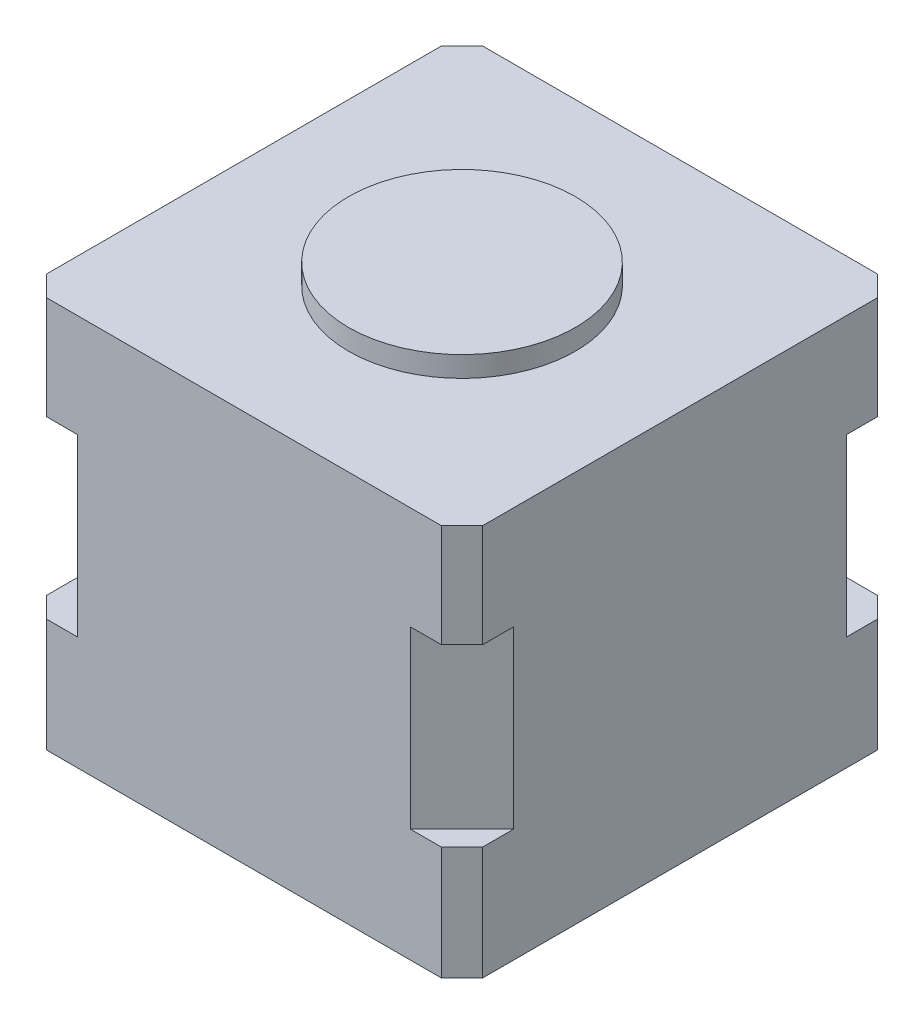
ISO-10303-21;
HEADER;
FILE_DESCRIPTION(('STEP AP214'),'2;1');
FILE_NAME('part.step','',(''),(''),'','','');
FILE_SCHEMA(('AUTOMOTIVE_DESIGN { 1 0 10303 214 1 1 1 1 }'));
ENDSEC;
DATA;
#1=APPLICATION_CONTEXT('core data for automotive mechanical design processes');
#2=APPLICATION_PROTOCOL_DEFINITION('international standard','automotive_design',2000,#1);
#3=PRODUCT_CONTEXT('',#1,'mechanical');
#4=PRODUCT('Part','Part','',(#3));
#5=PRODUCT_RELATED_PRODUCT_CATEGORY('part','',(#4));
#6=PRODUCT_DEFINITION_FORMATION('','',#4);
#7=PRODUCT_DEFINITION_CONTEXT('part definition',#1,'design');
#8=PRODUCT_DEFINITION('design','',#6,#7);
#9=PRODUCT_DEFINITION_SHAPE('','',#8);
#10=(LENGTH_UNIT() NAMED_UNIT(*) SI_UNIT(.MILLI.,.METRE.));
#11=(NAMED_UNIT(*) PLANE_ANGLE_UNIT() SI_UNIT($,.RADIAN.));
#12=(NAMED_UNIT(*) SI_UNIT($,.STERADIAN.) SOLID_ANGLE_UNIT());
#13=UNCERTAINTY_MEASURE_WITH_UNIT(LENGTH_MEASURE(1.E-05),#10,'distance_accuracy_value','');
#14=(GEOMETRIC_REPRESENTATION_CONTEXT(3) GLOBAL_UNCERTAINTY_ASSIGNED_CONTEXT((#13)) GLOBAL_UNIT_ASSIGNED_CONTEXT((#10,
#11,#12)) REPRESENTATION_CONTEXT('',''));
#15=CARTESIAN_POINT('',(0.,0.,0.));
#16=DIRECTION('',(0.,0.,1.));
#17=DIRECTION('',(1.,0.,0.));
#18=AXIS2_PLACEMENT_3D('',#15,#16,#17);
#19=CARTESIAN_POINT('',(0.,11.,0.));
#20=DIRECTION('',(0.,-1.,0.));
#21=DIRECTION('',(0.,0.,-1.));
#22=AXIS2_PLACEMENT_3D('',#19,#20,#21);
#23=PLANE('',#22);
#24=DIRECTION('',(0.707106781186548,0.,0.707106781186548));
#25=VECTOR('',#24,1.);
#26=CARTESIAN_POINT('',(-21.15,11.,16.15));
#27=LINE('',#26,#25);
#28=CARTESIAN_POINT('',(-21.15,11.,16.15));
#29=VERTEX_POINT('',#28);
#30=CARTESIAN_POINT('',(-16.15,11.,21.15));
#31=VERTEX_POINT('',#30);
#32=EDGE_CURVE('E66',#29,#31,#27,.T.);
#33=ORIENTED_EDGE('',*,*,#32,.F.);
#34=DIRECTION('',(0.,0.,1.));
#35=VECTOR('',#34,1.);
#36=CARTESIAN_POINT('',(-21.15,11.,-19.15));
#37=LINE('',#36,#35);
#38=CARTESIAN_POINT('',(-21.15,11.,19.15));
#39=VERTEX_POINT('',#38);
#40=EDGE_CURVE('E330',#29,#39,#37,.T.);
#41=ORIENTED_EDGE('',*,*,#40,.T.);
#42=DIRECTION('',(0.707106781186546,0.,0.707106781186549));
#43=VECTOR('',#42,1.);
#44=CARTESIAN_POINT('',(-21.15,11.,19.15));
#45=LINE('',#44,#43);
#46=CARTESIAN_POINT('',(-19.15,11.,21.15));
#47=VERTEX_POINT('',#46);
#48=EDGE_CURVE('E333',#39,#47,#45,.T.);
#49=ORIENTED_EDGE('',*,*,#48,.T.);
#50=DIRECTION('',(1.,0.,0.));
#51=VECTOR('',#50,1.);
#52=CARTESIAN_POINT('',(-19.15,11.,21.15));
#53=LINE('',#52,#51);
#54=EDGE_CURVE('E309',#47,#31,#53,.T.);
#55=ORIENTED_EDGE('',*,*,#54,.T.);
#56=EDGE_LOOP('',(#33,#41,#49,#55));
#57=FACE_BOUND('',#56,.T.);
#58=ADVANCED_FACE('F49',(#57),#23,.F.);
#59=DIRECTION('',(-0.707106781186548,0.,0.707106781186548));
#60=VECTOR('',#59,1.);
#61=CARTESIAN_POINT('',(-21.15,11.,-16.15));
#62=LINE('',#61,#60);
#63=CARTESIAN_POINT('',(-16.15,11.,-21.15));
#64=VERTEX_POINT('',#63);
#65=CARTESIAN_POINT('',(-21.15,11.,-16.15));
#66=VERTEX_POINT('',#65);
#67=EDGE_CURVE('E272',#64,#66,#62,.T.);
#68=ORIENTED_EDGE('',*,*,#67,.F.);
#69=DIRECTION('',(-1.,0.,0.));
#70=VECTOR('',#69,1.);
#71=CARTESIAN_POINT('',(-19.15,11.,-21.15));
#72=LINE('',#71,#70);
#73=CARTESIAN_POINT('',(-19.15,11.,-21.15));
#74=VERTEX_POINT('',#73);
#75=EDGE_CURVE('E323',#64,#74,#72,.T.);
#76=ORIENTED_EDGE('',*,*,#75,.T.);
#77=DIRECTION('',(-0.707106781186549,0.,0.707106781186546));
#78=VECTOR('',#77,1.);
#79=CARTESIAN_POINT('',(-21.15,11.,-19.15));
#80=LINE('',#79,#78);
#81=CARTESIAN_POINT('',(-21.15,11.,-19.15));
#82=VERTEX_POINT('',#81);
#83=EDGE_CURVE('E327',#74,#82,#80,.T.);
#84=ORIENTED_EDGE('',*,*,#83,.T.);
#85=EDGE_CURVE('E74',#82,#66,#37,.T.);
#86=ORIENTED_EDGE('',*,*,#85,.T.);
#87=EDGE_LOOP('',(#68,#76,#84,#86));
#88=FACE_BOUND('',#87,.T.);
#89=ADVANCED_FACE('F554',(#88),#23,.F.);
#90=DIRECTION('',(-0.707106781186547,0.,-0.707106781186548));
#91=VECTOR('',#90,1.);
#92=CARTESIAN_POINT('',(16.15,11.,-21.15));
#93=LINE('',#92,#91);
#94=CARTESIAN_POINT('',(21.15,11.,-16.15));
#95=VERTEX_POINT('',#94);
#96=CARTESIAN_POINT('',(16.15,11.,-21.15));
#97=VERTEX_POINT('',#96);
#98=EDGE_CURVE('E246',#95,#97,#93,.T.);
#99=ORIENTED_EDGE('',*,*,#98,.F.);
#100=DIRECTION('',(0.,0.,-1.));
#101=VECTOR('',#100,1.);
#102=CARTESIAN_POINT('',(21.15,11.,-19.15));
#103=LINE('',#102,#101);
#104=CARTESIAN_POINT('',(21.15,11.,-19.15));
#105=VERTEX_POINT('',#104);
#106=EDGE_CURVE('E316',#95,#105,#103,.T.);
#107=ORIENTED_EDGE('',*,*,#106,.T.);
#108=DIRECTION('',(-0.707106781186549,0.,-0.707106781186546));
#109=VECTOR('',#108,1.);
#110=CARTESIAN_POINT('',(19.15,11.,-21.15));
#111=LINE('',#110,#109);
#112=CARTESIAN_POINT('',(19.15,11.,-21.15));
#113=VERTEX_POINT('',#112);
#114=EDGE_CURVE('E320',#105,#113,#111,.T.);
#115=ORIENTED_EDGE('',*,*,#114,.T.);
#116=EDGE_CURVE('E324',#113,#97,#72,.T.);
#117=ORIENTED_EDGE('',*,*,#116,.T.);
#118=EDGE_LOOP('',(#99,#107,#115,#117));
#119=FACE_BOUND('',#118,.T.);
#120=ADVANCED_FACE('F414',(#119),#23,.F.);
#121=DIRECTION('',(0.707106781186548,0.,-0.707106781186548));
#122=VECTOR('',#121,1.);
#123=CARTESIAN_POINT('',(16.15,11.,21.15));
#124=LINE('',#123,#122);
#125=CARTESIAN_POINT('',(16.15,11.,21.15));
#126=VERTEX_POINT('',#125);
#127=CARTESIAN_POINT('',(21.15,11.,16.15));
#128=VERTEX_POINT('',#127);
#129=EDGE_CURVE('E241',#126,#128,#124,.T.);
#130=ORIENTED_EDGE('',*,*,#129,.F.);
#131=CARTESIAN_POINT('',(19.15,11.,21.15));
#132=VERTEX_POINT('',#131);
#133=EDGE_CURVE('E313',#126,#132,#53,.T.);
#134=ORIENTED_EDGE('',*,*,#133,.T.);
#135=DIRECTION('',(0.707106781186549,0.,-0.707106781186546));
#136=VECTOR('',#135,1.);
#137=CARTESIAN_POINT('',(19.15,11.,21.15));
#138=LINE('',#137,#136);
#139=CARTESIAN_POINT('',(21.15,11.,19.15));
#140=VERTEX_POINT('',#139);
#141=EDGE_CURVE('E312',#132,#140,#138,.T.);
#142=ORIENTED_EDGE('',*,*,#141,.T.);
#143=EDGE_CURVE('E317',#140,#128,#103,.T.);
#144=ORIENTED_EDGE('',*,*,#143,.T.);
#145=EDGE_LOOP('',(#130,#134,#142,#144));
#146=FACE_BOUND('',#145,.T.);
#147=ADVANCED_FACE('F418',(#146),#23,.F.);
#148=CARTESIAN_POINT('',(-19.15,11.,21.15));
#149=DIRECTION('',(0.,0.,-1.));
#150=DIRECTION('',(-1.,0.,0.));
#151=AXIS2_PLACEMENT_3D('',#148,#149,#150);
#152=PLANE('',#151);
#153=DIRECTION('',(1.,0.,0.));
#154=VECTOR('',#153,1.);
#155=CARTESIAN_POINT('',(-19.15,0.,21.15));
#156=LINE('',#155,#154);
#157=CARTESIAN_POINT('',(-19.15,0.,21.15));
#158=VERTEX_POINT('',#157);
#159=CARTESIAN_POINT('',(19.15,0.,21.15));
#160=VERTEX_POINT('',#159);
#161=EDGE_CURVE('E308',#158,#160,#156,.T.);
#162=ORIENTED_EDGE('',*,*,#161,.T.);
#163=DIRECTION('',(0.,-1.,0.));
#164=VECTOR('',#163,1.);
#165=CARTESIAN_POINT('',(19.15,11.,21.15));
#166=LINE('',#165,#164);
#167=EDGE_CURVE('E53',#132,#160,#166,.T.);
#168=ORIENTED_EDGE('',*,*,#167,.F.);
#169=ORIENTED_EDGE('',*,*,#133,.F.);
#170=DIRECTION('',(0.,-1.,0.));
#171=VECTOR('',#170,1.);
#172=CARTESIAN_POINT('',(16.15,28.,21.15));
#173=LINE('',#172,#171);
#174=CARTESIAN_POINT('',(16.15,28.,21.15));
#175=VERTEX_POINT('',#174);
#176=EDGE_CURVE('E304',#175,#126,#173,.T.);
#177=ORIENTED_EDGE('',*,*,#176,.F.);
#178=DIRECTION('',(1.,0.,0.));
#179=VECTOR('',#178,1.);
#180=CARTESIAN_POINT('',(-19.15,28.,21.15));
#181=LINE('',#180,#179);
#182=CARTESIAN_POINT('',(19.15,28.,21.15));
#183=VERTEX_POINT('',#182);
#184=EDGE_CURVE('E238',#175,#183,#181,.T.);
#185=ORIENTED_EDGE('',*,*,#184,.T.);
#186=DIRECTION('',(0.,-1.,0.));
#187=VECTOR('',#186,1.);
#188=CARTESIAN_POINT('',(19.15,38.,21.15));
#189=LINE('',#188,#187);
#190=CARTESIAN_POINT('',(19.15,38.,21.15));
#191=VERTEX_POINT('',#190);
#192=EDGE_CURVE('E216',#191,#183,#189,.T.);
#193=ORIENTED_EDGE('',*,*,#192,.F.);
#194=DIRECTION('',(1.,0.,0.));
#195=VECTOR('',#194,1.);
#196=CARTESIAN_POINT('',(-19.15,38.,21.15));
#197=LINE('',#196,#195);
#198=CARTESIAN_POINT('',(-19.15,38.,21.15));
#199=VERTEX_POINT('',#198);
#200=EDGE_CURVE('E223',#199,#191,#197,.T.);
#201=ORIENTED_EDGE('',*,*,#200,.F.);
#202=DIRECTION('',(0.,-1.,0.));
#203=VECTOR('',#202,1.);
#204=CARTESIAN_POINT('',(-19.15,38.,21.15));
#205=LINE('',#204,#203);
#206=CARTESIAN_POINT('',(-19.15,28.,21.15));
#207=VERTEX_POINT('',#206);
#208=EDGE_CURVE('E452',#199,#207,#205,.T.);
#209=ORIENTED_EDGE('',*,*,#208,.T.);
#210=CARTESIAN_POINT('',(-16.15,28.,21.15));
#211=VERTEX_POINT('',#210);
#212=EDGE_CURVE('E503',#207,#211,#181,.T.);
#213=ORIENTED_EDGE('',*,*,#212,.T.);
#214=DIRECTION('',(0.,-1.,0.));
#215=VECTOR('',#214,1.);
#216=CARTESIAN_POINT('',(-16.15,28.,21.15));
#217=LINE('',#216,#215);
#218=EDGE_CURVE('E267',#211,#31,#217,.T.);
#219=ORIENTED_EDGE('',*,*,#218,.T.);
#220=ORIENTED_EDGE('',*,*,#54,.F.);
#221=DIRECTION('',(0.,-1.,0.));
#222=VECTOR('',#221,1.);
#223=CARTESIAN_POINT('',(-19.15,11.,21.15));
#224=LINE('',#223,#222);
#225=EDGE_CURVE('E336',#47,#158,#224,.T.);
#226=ORIENTED_EDGE('',*,*,#225,.T.);
#227=EDGE_LOOP('',(#162,#168,#169,#177,#185,#193,#201,#209,#213,#219,#220,#226));
#228=FACE_BOUND('',#227,.T.);
#229=ADVANCED_FACE('F51',(#228),#152,.F.);
#230=CARTESIAN_POINT('',(19.15,11.,21.15));
#231=DIRECTION('',(-0.707106781186546,0.,-0.707106781186549));
#232=DIRECTION('',(-0.707106781186549,0.,0.707106781186546));
#233=AXIS2_PLACEMENT_3D('',#230,#231,#232);
#234=PLANE('',#233);
#235=DIRECTION('',(0.707106781186549,0.,-0.707106781186546));
#236=VECTOR('',#235,1.);
#237=CARTESIAN_POINT('',(19.15,0.,21.15));
#238=LINE('',#237,#236);
#239=CARTESIAN_POINT('',(21.15,0.,19.15));
#240=VERTEX_POINT('',#239);
#241=EDGE_CURVE('E339',#160,#240,#238,.T.);
#242=ORIENTED_EDGE('',*,*,#241,.T.);
#243=DIRECTION('',(0.,-1.,0.));
#244=VECTOR('',#243,1.);
#245=CARTESIAN_POINT('',(21.15,11.,19.15));
#246=LINE('',#245,#244);
#247=EDGE_CURVE('E382',#140,#240,#246,.T.);
#248=ORIENTED_EDGE('',*,*,#247,.F.);
#249=ORIENTED_EDGE('',*,*,#141,.F.);
#250=ORIENTED_EDGE('',*,*,#167,.T.);
#251=EDGE_LOOP('',(#242,#248,#249,#250));
#252=FACE_BOUND('',#251,.T.);
#253=ADVANCED_FACE('F394',(#252),#234,.F.);
#254=CARTESIAN_POINT('',(21.15,11.,-19.15));
#255=DIRECTION('',(-1.,0.,0.));
#256=DIRECTION('',(0.,0.,1.));
#257=AXIS2_PLACEMENT_3D('',#254,#255,#256);
#258=PLANE('',#257);
#259=DIRECTION('',(0.,0.,-1.));
#260=VECTOR('',#259,1.);
#261=CARTESIAN_POINT('',(21.15,0.,-19.15));
#262=LINE('',#261,#260);
#263=CARTESIAN_POINT('',(21.15,0.,-19.15));
#264=VERTEX_POINT('',#263);
#265=EDGE_CURVE('E342',#240,#264,#262,.T.);
#266=ORIENTED_EDGE('',*,*,#265,.T.);
#267=DIRECTION('',(0.,-1.,0.));
#268=VECTOR('',#267,1.);
#269=CARTESIAN_POINT('',(21.15,11.,-19.15));
#270=LINE('',#269,#268);
#271=EDGE_CURVE('E379',#105,#264,#270,.T.);
#272=ORIENTED_EDGE('',*,*,#271,.F.);
#273=ORIENTED_EDGE('',*,*,#106,.F.);
#274=DIRECTION('',(0.,-1.,0.));
#275=VECTOR('',#274,1.);
#276=CARTESIAN_POINT('',(21.15,28.,-16.15));
#277=LINE('',#276,#275);
#278=CARTESIAN_POINT('',(21.15,28.,-16.15));
#279=VERTEX_POINT('',#278);
#280=EDGE_CURVE('E296',#279,#95,#277,.T.);
#281=ORIENTED_EDGE('',*,*,#280,.F.);
#282=DIRECTION('',(0.,0.,-1.));
#283=VECTOR('',#282,1.);
#284=CARTESIAN_POINT('',(21.15,28.,-19.15));
#285=LINE('',#284,#283);
#286=CARTESIAN_POINT('',(21.15,28.,-19.15));
#287=VERTEX_POINT('',#286);
#288=EDGE_CURVE('E428',#279,#287,#285,.T.);
#289=ORIENTED_EDGE('',*,*,#288,.T.);
#290=DIRECTION('',(0.,-1.,0.));
#291=VECTOR('',#290,1.);
#292=CARTESIAN_POINT('',(21.15,38.,-19.15));
#293=LINE('',#292,#291);
#294=CARTESIAN_POINT('',(21.15,38.,-19.15));
#295=VERTEX_POINT('',#294);
#296=EDGE_CURVE('E248',#295,#287,#293,.T.);
#297=ORIENTED_EDGE('',*,*,#296,.F.);
#298=DIRECTION('',(0.,0.,-1.));
#299=VECTOR('',#298,1.);
#300=CARTESIAN_POINT('',(21.15,38.,-19.15));
#301=LINE('',#300,#299);
#302=CARTESIAN_POINT('',(21.15,38.,19.15));
#303=VERTEX_POINT('',#302);
#304=EDGE_CURVE('E222',#303,#295,#301,.T.);
#305=ORIENTED_EDGE('',*,*,#304,.F.);
#306=DIRECTION('',(0.,-1.,0.));
#307=VECTOR('',#306,1.);
#308=CARTESIAN_POINT('',(21.15,38.,19.15));
#309=LINE('',#308,#307);
#310=CARTESIAN_POINT('',(21.15,28.,19.15));
#311=VERTEX_POINT('',#310);
#312=EDGE_CURVE('E218',#303,#311,#309,.T.);
#313=ORIENTED_EDGE('',*,*,#312,.T.);
#314=CARTESIAN_POINT('',(21.15,28.,16.15));
#315=VERTEX_POINT('',#314);
#316=EDGE_CURVE('E425',#311,#315,#285,.T.);
#317=ORIENTED_EDGE('',*,*,#316,.T.);
#318=DIRECTION('',(0.,-1.,0.));
#319=VECTOR('',#318,1.);
#320=CARTESIAN_POINT('',(21.15,28.,16.15));
#321=LINE('',#320,#319);
#322=EDGE_CURVE('E300',#315,#128,#321,.T.);
#323=ORIENTED_EDGE('',*,*,#322,.T.);
#324=ORIENTED_EDGE('',*,*,#143,.F.);
#325=ORIENTED_EDGE('',*,*,#247,.T.);
#326=EDGE_LOOP('',(#266,#272,#273,#281,#289,#297,#305,#313,#317,#323,#324,#325));
#327=FACE_BOUND('',#326,.T.);
#328=ADVANCED_FACE('F406',(#327),#258,.F.);
#329=CARTESIAN_POINT('',(19.15,11.,-21.15));
#330=DIRECTION('',(-0.707106781186546,0.,0.707106781186549));
#331=DIRECTION('',(0.707106781186549,0.,0.707106781186546));
#332=AXIS2_PLACEMENT_3D('',#329,#330,#331);
#333=PLANE('',#332);
#334=DIRECTION('',(-0.707106781186549,0.,-0.707106781186546));
#335=VECTOR('',#334,1.);
#336=CARTESIAN_POINT('',(19.15,0.,-21.15));
#337=LINE('',#336,#335);
#338=CARTESIAN_POINT('',(19.15,0.,-21.15));
#339=VERTEX_POINT('',#338);
#340=EDGE_CURVE('E345',#264,#339,#337,.T.);
#341=ORIENTED_EDGE('',*,*,#340,.T.);
#342=DIRECTION('',(0.,-1.,0.));
#343=VECTOR('',#342,1.);
#344=CARTESIAN_POINT('',(19.15,11.,-21.15));
#345=LINE('',#344,#343);
#346=EDGE_CURVE('E375',#113,#339,#345,.T.);
#347=ORIENTED_EDGE('',*,*,#346,.F.);
#348=ORIENTED_EDGE('',*,*,#114,.F.);
#349=ORIENTED_EDGE('',*,*,#271,.T.);
#350=EDGE_LOOP('',(#341,#347,#348,#349));
#351=FACE_BOUND('',#350,.T.);
#352=ADVANCED_FACE('F410',(#351),#333,.F.);
#353=CARTESIAN_POINT('',(-19.15,11.,-21.15));
#354=DIRECTION('',(0.,0.,1.));
#355=DIRECTION('',(1.,0.,0.));
#356=AXIS2_PLACEMENT_3D('',#353,#354,#355);
#357=PLANE('',#356);
#358=DIRECTION('',(-1.,0.,0.));
#359=VECTOR('',#358,1.);
#360=CARTESIAN_POINT('',(-19.15,0.,-21.15));
#361=LINE('',#360,#359);
#362=CARTESIAN_POINT('',(-19.15,0.,-21.15));
#363=VERTEX_POINT('',#362);
#364=EDGE_CURVE('E348',#339,#363,#361,.T.);
#365=ORIENTED_EDGE('',*,*,#364,.T.);
#366=DIRECTION('',(0.,-1.,0.));
#367=VECTOR('',#366,1.);
#368=CARTESIAN_POINT('',(-19.15,11.,-21.15));
#369=LINE('',#368,#367);
#370=EDGE_CURVE('E371',#74,#363,#369,.T.);
#371=ORIENTED_EDGE('',*,*,#370,.F.);
#372=ORIENTED_EDGE('',*,*,#75,.F.);
#373=DIRECTION('',(0.,-1.,0.));
#374=VECTOR('',#373,1.);
#375=CARTESIAN_POINT('',(-16.15,28.,-21.15));
#376=LINE('',#375,#374);
#377=CARTESIAN_POINT('',(-16.15,28.,-21.15));
#378=VERTEX_POINT('',#377);
#379=EDGE_CURVE('E288',#378,#64,#376,.T.);
#380=ORIENTED_EDGE('',*,*,#379,.F.);
#381=DIRECTION('',(-1.,0.,0.));
#382=VECTOR('',#381,1.);
#383=CARTESIAN_POINT('',(-19.15,28.,-21.15));
#384=LINE('',#383,#382);
#385=CARTESIAN_POINT('',(-19.15,28.,-21.15));
#386=VERTEX_POINT('',#385);
#387=EDGE_CURVE('E432',#378,#386,#384,.T.);
#388=ORIENTED_EDGE('',*,*,#387,.T.);
#389=DIRECTION('',(0.,-1.,0.));
#390=VECTOR('',#389,1.);
#391=CARTESIAN_POINT('',(-19.15,38.,-21.15));
#392=LINE('',#391,#390);
#393=CARTESIAN_POINT('',(-19.15,38.,-21.15));
#394=VERTEX_POINT('',#393);
#395=EDGE_CURVE('E463',#394,#386,#392,.T.);
#396=ORIENTED_EDGE('',*,*,#395,.F.);
#397=DIRECTION('',(-1.,0.,0.));
#398=VECTOR('',#397,1.);
#399=CARTESIAN_POINT('',(-19.15,38.,-21.15));
#400=LINE('',#399,#398);
#401=CARTESIAN_POINT('',(19.15,38.,-21.15));
#402=VERTEX_POINT('',#401);
#403=EDGE_CURVE('E488',#402,#394,#400,.T.);
#404=ORIENTED_EDGE('',*,*,#403,.F.);
#405=DIRECTION('',(0.,-1.,0.));
#406=VECTOR('',#405,1.);
#407=CARTESIAN_POINT('',(19.15,38.,-21.15));
#408=LINE('',#407,#406);
#409=CARTESIAN_POINT('',(19.15,28.,-21.15));
#410=VERTEX_POINT('',#409);
#411=EDGE_CURVE('E467',#402,#410,#408,.T.);
#412=ORIENTED_EDGE('',*,*,#411,.T.);
#413=CARTESIAN_POINT('',(16.15,28.,-21.15));
#414=VERTEX_POINT('',#413);
#415=EDGE_CURVE('E438',#410,#414,#384,.T.);
#416=ORIENTED_EDGE('',*,*,#415,.T.);
#417=DIRECTION('',(0.,-1.,0.));
#418=VECTOR('',#417,1.);
#419=CARTESIAN_POINT('',(16.15,28.,-21.15));
#420=LINE('',#419,#418);
#421=EDGE_CURVE('E292',#414,#97,#420,.T.);
#422=ORIENTED_EDGE('',*,*,#421,.T.);
#423=ORIENTED_EDGE('',*,*,#116,.F.);
#424=ORIENTED_EDGE('',*,*,#346,.T.);
#425=EDGE_LOOP('',(#365,#371,#372,#380,#388,#396,#404,#412,#416,#422,#423,#424));
#426=FACE_BOUND('',#425,.T.);
#427=ADVANCED_FACE('F485',(#426),#357,.F.);
#428=CARTESIAN_POINT('',(-21.15,11.,-19.15));
#429=DIRECTION('',(0.707106781186546,0.,0.707106781186549));
#430=DIRECTION('',(0.707106781186549,0.,-0.707106781186546));
#431=AXIS2_PLACEMENT_3D('',#428,#429,#430);
#432=PLANE('',#431);
#433=DIRECTION('',(-0.707106781186549,0.,0.707106781186546));
#434=VECTOR('',#433,1.);
#435=CARTESIAN_POINT('',(-21.15,0.,-19.15));
#436=LINE('',#435,#434);
#437=CARTESIAN_POINT('',(-21.15,0.,-19.15));
#438=VERTEX_POINT('',#437);
#439=EDGE_CURVE('E351',#363,#438,#436,.T.);
#440=ORIENTED_EDGE('',*,*,#439,.T.);
#441=DIRECTION('',(0.,-1.,0.));
#442=VECTOR('',#441,1.);
#443=CARTESIAN_POINT('',(-21.15,11.,-19.15));
#444=LINE('',#443,#442);
#445=EDGE_CURVE('E367',#82,#438,#444,.T.);
#446=ORIENTED_EDGE('',*,*,#445,.F.);
#447=ORIENTED_EDGE('',*,*,#83,.F.);
#448=ORIENTED_EDGE('',*,*,#370,.T.);
#449=EDGE_LOOP('',(#440,#446,#447,#448));
#450=FACE_BOUND('',#449,.T.);
#451=ADVANCED_FACE('F548',(#450),#432,.F.);
#452=CARTESIAN_POINT('',(-21.15,11.,-19.15));
#453=DIRECTION('',(1.,0.,0.));
#454=DIRECTION('',(0.,0.,-1.));
#455=AXIS2_PLACEMENT_3D('',#452,#453,#454);
#456=PLANE('',#455);
#457=DIRECTION('',(0.,0.,1.));
#458=VECTOR('',#457,1.);
#459=CARTESIAN_POINT('',(-21.15,0.,-19.15));
#460=LINE('',#459,#458);
#461=CARTESIAN_POINT('',(-21.15,0.,19.15));
#462=VERTEX_POINT('',#461);
#463=EDGE_CURVE('E354',#438,#462,#460,.T.);
#464=ORIENTED_EDGE('',*,*,#463,.T.);
#465=DIRECTION('',(0.,-1.,0.));
#466=VECTOR('',#465,1.);
#467=CARTESIAN_POINT('',(-21.15,11.,19.15));
#468=LINE('',#467,#466);
#469=EDGE_CURVE('E363',#39,#462,#468,.T.);
#470=ORIENTED_EDGE('',*,*,#469,.F.);
#471=ORIENTED_EDGE('',*,*,#40,.F.);
#472=DIRECTION('',(0.,-1.,0.));
#473=VECTOR('',#472,1.);
#474=CARTESIAN_POINT('',(-21.15,28.,16.15));
#475=LINE('',#474,#473);
#476=CARTESIAN_POINT('',(-21.15,28.,16.15));
#477=VERTEX_POINT('',#476);
#478=EDGE_CURVE('E280',#477,#29,#475,.T.);
#479=ORIENTED_EDGE('',*,*,#478,.F.);
#480=DIRECTION('',(0.,0.,1.));
#481=VECTOR('',#480,1.);
#482=CARTESIAN_POINT('',(-21.15,28.,-19.15));
#483=LINE('',#482,#481);
#484=CARTESIAN_POINT('',(-21.15,28.,19.15));
#485=VERTEX_POINT('',#484);
#486=EDGE_CURVE('E445',#477,#485,#483,.T.);
#487=ORIENTED_EDGE('',*,*,#486,.T.);
#488=DIRECTION('',(0.,-1.,0.));
#489=VECTOR('',#488,1.);
#490=CARTESIAN_POINT('',(-21.15,38.,19.15));
#491=LINE('',#490,#489);
#492=CARTESIAN_POINT('',(-21.15,38.,19.15));
#493=VERTEX_POINT('',#492);
#494=EDGE_CURVE('E455',#493,#485,#491,.T.);
#495=ORIENTED_EDGE('',*,*,#494,.F.);
#496=DIRECTION('',(0.,0.,1.));
#497=VECTOR('',#496,1.);
#498=CARTESIAN_POINT('',(-21.15,38.,-19.15));
#499=LINE('',#498,#497);
#500=CARTESIAN_POINT('',(-21.15,38.,-19.15));
#501=VERTEX_POINT('',#500);
#502=EDGE_CURVE('E495',#501,#493,#499,.T.);
#503=ORIENTED_EDGE('',*,*,#502,.F.);
#504=DIRECTION('',(0.,-1.,0.));
#505=VECTOR('',#504,1.);
#506=CARTESIAN_POINT('',(-21.15,38.,-19.15));
#507=LINE('',#506,#505);
#508=CARTESIAN_POINT('',(-21.15,28.,-19.15));
#509=VERTEX_POINT('',#508);
#510=EDGE_CURVE('E459',#501,#509,#507,.T.);
#511=ORIENTED_EDGE('',*,*,#510,.T.);
#512=CARTESIAN_POINT('',(-21.15,28.,-16.15));
#513=VERTEX_POINT('',#512);
#514=EDGE_CURVE('E446',#509,#513,#483,.T.);
#515=ORIENTED_EDGE('',*,*,#514,.T.);
#516=DIRECTION('',(0.,-1.,0.));
#517=VECTOR('',#516,1.);
#518=CARTESIAN_POINT('',(-21.15,28.,-16.15));
#519=LINE('',#518,#517);
#520=EDGE_CURVE('E284',#513,#66,#519,.T.);
#521=ORIENTED_EDGE('',*,*,#520,.T.);
#522=ORIENTED_EDGE('',*,*,#85,.F.);
#523=ORIENTED_EDGE('',*,*,#445,.T.);
#524=EDGE_LOOP('',(#464,#470,#471,#479,#487,#495,#503,#511,#515,#521,#522,#523));
#525=FACE_BOUND('',#524,.T.);
#526=ADVANCED_FACE('F529',(#525),#456,.F.);
#527=CARTESIAN_POINT('',(-21.15,11.,19.15));
#528=DIRECTION('',(0.707106781186549,0.,-0.707106781186546));
#529=DIRECTION('',(-0.707106781186546,0.,-0.707106781186549));
#530=AXIS2_PLACEMENT_3D('',#527,#528,#529);
#531=PLANE('',#530);
#532=DIRECTION('',(0.707106781186546,0.,0.707106781186549));
#533=VECTOR('',#532,1.);
#534=CARTESIAN_POINT('',(-21.15,0.,19.15));
#535=LINE('',#534,#533);
#536=EDGE_CURVE('E357',#462,#158,#535,.T.);
#537=ORIENTED_EDGE('',*,*,#536,.T.);
#538=ORIENTED_EDGE('',*,*,#225,.F.);
#539=ORIENTED_EDGE('',*,*,#48,.F.);
#540=ORIENTED_EDGE('',*,*,#469,.T.);
#541=EDGE_LOOP('',(#537,#538,#539,#540));
#542=FACE_BOUND('',#541,.T.);
#543=ADVANCED_FACE('F544',(#542),#531,.F.);
#544=CARTESIAN_POINT('',(0.,0.,0.));
#545=DIRECTION('',(0.,-1.,0.));
#546=DIRECTION('',(0.,0.,-1.));
#547=AXIS2_PLACEMENT_3D('',#544,#545,#546);
#548=PLANE('',#547);
#549=ORIENTED_EDGE('',*,*,#161,.F.);
#550=ORIENTED_EDGE('',*,*,#536,.F.);
#551=ORIENTED_EDGE('',*,*,#463,.F.);
#552=ORIENTED_EDGE('',*,*,#439,.F.);
#553=ORIENTED_EDGE('',*,*,#364,.F.);
#554=ORIENTED_EDGE('',*,*,#340,.F.);
#555=ORIENTED_EDGE('',*,*,#265,.F.);
#556=ORIENTED_EDGE('',*,*,#241,.F.);
#557=EDGE_LOOP('',(#549,#550,#551,#552,#553,#554,#555,#556));
#558=FACE_BOUND('',#557,.T.);
#559=ADVANCED_FACE('F401',(#558),#548,.T.);
#560=CARTESIAN_POINT('',(16.15,28.,21.15));
#561=DIRECTION('',(-0.707106781186547,0.,-0.707106781186547));
#562=DIRECTION('',(-0.707106781186548,0.,0.707106781186548));
#563=AXIS2_PLACEMENT_3D('',#560,#561,#562);
#564=PLANE('',#563);
#565=ORIENTED_EDGE('',*,*,#129,.T.);
#566=ORIENTED_EDGE('',*,*,#322,.F.);
#567=DIRECTION('',(0.707106781186548,0.,-0.707106781186548));
#568=VECTOR('',#567,1.);
#569=CARTESIAN_POINT('',(16.15,28.,21.15));
#570=LINE('',#569,#568);
#571=EDGE_CURVE('E252',#175,#315,#570,.T.);
#572=ORIENTED_EDGE('',*,*,#571,.F.);
#573=ORIENTED_EDGE('',*,*,#176,.T.);
#574=EDGE_LOOP('',(#565,#566,#572,#573));
#575=FACE_BOUND('',#574,.T.);
#576=ADVANCED_FACE('F420',(#575),#564,.F.);
#577=CARTESIAN_POINT('',(16.15,28.,-21.15));
#578=DIRECTION('',(-0.707106781186548,0.,0.707106781186547));
#579=DIRECTION('',(0.707106781186547,0.,0.707106781186548));
#580=AXIS2_PLACEMENT_3D('',#577,#578,#579);
#581=PLANE('',#580);
#582=ORIENTED_EDGE('',*,*,#98,.T.);
#583=ORIENTED_EDGE('',*,*,#421,.F.);
#584=DIRECTION('',(-0.707106781186547,0.,-0.707106781186548));
#585=VECTOR('',#584,1.);
#586=CARTESIAN_POINT('',(16.15,28.,-21.15));
#587=LINE('',#586,#585);
#588=EDGE_CURVE('E256',#279,#414,#587,.T.);
#589=ORIENTED_EDGE('',*,*,#588,.F.);
#590=ORIENTED_EDGE('',*,*,#280,.T.);
#591=EDGE_LOOP('',(#582,#583,#589,#590));
#592=FACE_BOUND('',#591,.T.);
#593=ADVANCED_FACE('F611',(#592),#581,.F.);
#594=CARTESIAN_POINT('',(-21.15,28.,-16.15));
#595=DIRECTION('',(0.707106781186547,0.,0.707106781186547));
#596=DIRECTION('',(0.707106781186548,0.,-0.707106781186548));
#597=AXIS2_PLACEMENT_3D('',#594,#595,#596);
#598=PLANE('',#597);
#599=ORIENTED_EDGE('',*,*,#67,.T.);
#600=ORIENTED_EDGE('',*,*,#520,.F.);
#601=DIRECTION('',(-0.707106781186548,0.,0.707106781186548));
#602=VECTOR('',#601,1.);
#603=CARTESIAN_POINT('',(-21.15,28.,-16.15));
#604=LINE('',#603,#602);
#605=EDGE_CURVE('E260',#378,#513,#604,.T.);
#606=ORIENTED_EDGE('',*,*,#605,.F.);
#607=ORIENTED_EDGE('',*,*,#379,.T.);
#608=EDGE_LOOP('',(#599,#600,#606,#607));
#609=FACE_BOUND('',#608,.T.);
#610=ADVANCED_FACE('F553',(#609),#598,.F.);
#611=CARTESIAN_POINT('',(-21.15,28.,16.15));
#612=DIRECTION('',(0.707106781186547,0.,-0.707106781186547));
#613=DIRECTION('',(-0.707106781186548,0.,-0.707106781186548));
#614=AXIS2_PLACEMENT_3D('',#611,#612,#613);
#615=PLANE('',#614);
#616=ORIENTED_EDGE('',*,*,#32,.T.);
#617=ORIENTED_EDGE('',*,*,#218,.F.);
#618=DIRECTION('',(0.707106781186548,0.,0.707106781186548));
#619=VECTOR('',#618,1.);
#620=CARTESIAN_POINT('',(-21.15,28.,16.15));
#621=LINE('',#620,#619);
#622=EDGE_CURVE('E264',#477,#211,#621,.T.);
#623=ORIENTED_EDGE('',*,*,#622,.F.);
#624=ORIENTED_EDGE('',*,*,#478,.T.);
#625=EDGE_LOOP('',(#616,#617,#623,#624));
#626=FACE_BOUND('',#625,.T.);
#627=ADVANCED_FACE('F540',(#626),#615,.F.);
#628=CARTESIAN_POINT('',(0.,28.,0.));
#629=DIRECTION('',(0.,-1.,0.));
#630=DIRECTION('',(0.,0.,-1.));
#631=AXIS2_PLACEMENT_3D('',#628,#629,#630);
#632=PLANE('',#631);
#633=ORIENTED_EDGE('',*,*,#184,.F.);
#634=ORIENTED_EDGE('',*,*,#571,.T.);
#635=ORIENTED_EDGE('',*,*,#316,.F.);
#636=DIRECTION('',(0.707106781186547,0.,-0.707106781186548));
#637=VECTOR('',#636,1.);
#638=CARTESIAN_POINT('',(19.15,28.,21.15));
#639=LINE('',#638,#637);
#640=EDGE_CURVE('E434',#183,#311,#639,.T.);
#641=ORIENTED_EDGE('',*,*,#640,.F.);
#642=EDGE_LOOP('',(#633,#634,#635,#641));
#643=FACE_BOUND('',#642,.T.);
#644=ADVANCED_FACE('F424',(#643),#632,.T.);
#645=ORIENTED_EDGE('',*,*,#288,.F.);
#646=ORIENTED_EDGE('',*,*,#588,.T.);
#647=ORIENTED_EDGE('',*,*,#415,.F.);
#648=DIRECTION('',(-0.707106781186547,0.,-0.707106781186547));
#649=VECTOR('',#648,1.);
#650=CARTESIAN_POINT('',(19.15,28.,-21.15));
#651=LINE('',#650,#649);
#652=EDGE_CURVE('E427',#287,#410,#651,.T.);
#653=ORIENTED_EDGE('',*,*,#652,.F.);
#654=EDGE_LOOP('',(#645,#646,#647,#653));
#655=FACE_BOUND('',#654,.T.);
#656=ADVANCED_FACE('F482',(#655),#632,.T.);
#657=ORIENTED_EDGE('',*,*,#387,.F.);
#658=ORIENTED_EDGE('',*,*,#605,.T.);
#659=ORIENTED_EDGE('',*,*,#514,.F.);
#660=DIRECTION('',(-0.707106781186547,0.,0.707106781186548));
#661=VECTOR('',#660,1.);
#662=CARTESIAN_POINT('',(-21.15,28.,-19.15));
#663=LINE('',#662,#661);
#664=EDGE_CURVE('E442',#386,#509,#663,.T.);
#665=ORIENTED_EDGE('',*,*,#664,.F.);
#666=EDGE_LOOP('',(#657,#658,#659,#665));
#667=FACE_BOUND('',#666,.T.);
#668=ADVANCED_FACE('F527',(#667),#632,.T.);
#669=CARTESIAN_POINT('',(19.15,38.,21.15));
#670=DIRECTION('',(-0.707106781186548,0.,-0.707106781186547));
#671=DIRECTION('',(-0.707106781186547,0.,0.707106781186548));
#672=AXIS2_PLACEMENT_3D('',#669,#670,#671);
#673=PLANE('',#672);
#674=ORIENTED_EDGE('',*,*,#640,.T.);
#675=ORIENTED_EDGE('',*,*,#312,.F.);
#676=DIRECTION('',(0.707106781186547,0.,-0.707106781186548));
#677=VECTOR('',#676,1.);
#678=CARTESIAN_POINT('',(19.15,38.,21.15));
#679=LINE('',#678,#677);
#680=EDGE_CURVE('E212',#191,#303,#679,.T.);
#681=ORIENTED_EDGE('',*,*,#680,.F.);
#682=ORIENTED_EDGE('',*,*,#192,.T.);
#683=EDGE_LOOP('',(#674,#675,#681,#682));
#684=FACE_BOUND('',#683,.T.);
#685=ADVANCED_FACE('F214',(#684),#673,.F.);
#686=CARTESIAN_POINT('',(19.15,38.,-21.15));
#687=DIRECTION('',(-0.707106781186548,0.,0.707106781186548));
#688=DIRECTION('',(0.707106781186548,0.,0.707106781186548));
#689=AXIS2_PLACEMENT_3D('',#686,#687,#688);
#690=PLANE('',#689);
#691=ORIENTED_EDGE('',*,*,#652,.T.);
#692=ORIENTED_EDGE('',*,*,#411,.F.);
#693=DIRECTION('',(-0.707106781186547,0.,-0.707106781186547));
#694=VECTOR('',#693,1.);
#695=CARTESIAN_POINT('',(19.15,38.,-21.15));
#696=LINE('',#695,#694);
#697=EDGE_CURVE('E478',#295,#402,#696,.T.);
#698=ORIENTED_EDGE('',*,*,#697,.F.);
#699=ORIENTED_EDGE('',*,*,#296,.T.);
#700=EDGE_LOOP('',(#691,#692,#698,#699));
#701=FACE_BOUND('',#700,.T.);
#702=ADVANCED_FACE('F476',(#701),#690,.F.);
#703=CARTESIAN_POINT('',(-21.15,38.,-19.15));
#704=DIRECTION('',(0.707106781186548,0.,0.707106781186547));
#705=DIRECTION('',(0.707106781186547,0.,-0.707106781186548));
#706=AXIS2_PLACEMENT_3D('',#703,#704,#705);
#707=PLANE('',#706);
#708=ORIENTED_EDGE('',*,*,#664,.T.);
#709=ORIENTED_EDGE('',*,*,#510,.F.);
#710=DIRECTION('',(-0.707106781186547,0.,0.707106781186548));
#711=VECTOR('',#710,1.);
#712=CARTESIAN_POINT('',(-21.15,38.,-19.15));
#713=LINE('',#712,#711);
#714=EDGE_CURVE('E491',#394,#501,#713,.T.);
#715=ORIENTED_EDGE('',*,*,#714,.F.);
#716=ORIENTED_EDGE('',*,*,#395,.T.);
#717=EDGE_LOOP('',(#708,#709,#715,#716));
#718=FACE_BOUND('',#717,.T.);
#719=ADVANCED_FACE('F524',(#718),#707,.F.);
#720=CARTESIAN_POINT('',(-21.15,38.,19.15));
#721=DIRECTION('',(0.707106781186548,0.,-0.707106781186547));
#722=DIRECTION('',(-0.707106781186547,0.,-0.707106781186548));
#723=AXIS2_PLACEMENT_3D('',#720,#721,#722);
#724=PLANE('',#723);
#725=DIRECTION('',(0.707106781186547,0.,0.707106781186548));
#726=VECTOR('',#725,1.);
#727=CARTESIAN_POINT('',(-21.15,28.,19.15));
#728=LINE('',#727,#726);
#729=EDGE_CURVE('E233',#485,#207,#728,.T.);
#730=ORIENTED_EDGE('',*,*,#729,.T.);
#731=ORIENTED_EDGE('',*,*,#208,.F.);
#732=DIRECTION('',(0.707106781186547,0.,0.707106781186548));
#733=VECTOR('',#732,1.);
#734=CARTESIAN_POINT('',(-21.15,38.,19.15));
#735=LINE('',#734,#733);
#736=EDGE_CURVE('E228',#493,#199,#735,.T.);
#737=ORIENTED_EDGE('',*,*,#736,.F.);
#738=ORIENTED_EDGE('',*,*,#494,.T.);
#739=EDGE_LOOP('',(#730,#731,#737,#738));
#740=FACE_BOUND('',#739,.T.);
#741=ADVANCED_FACE('F535',(#740),#724,.F.);
#742=CARTESIAN_POINT('',(0.,38.,0.));
#743=DIRECTION('',(0.,-1.,0.));
#744=DIRECTION('',(0.,0.,-1.));
#745=AXIS2_PLACEMENT_3D('',#742,#743,#744);
#746=PLANE('',#745);
#747=CARTESIAN_POINT('',(0.,38.,0.));
#748=DIRECTION('',(0.,1.,0.));
#749=DIRECTION('',(0.,0.,1.));
#750=AXIS2_PLACEMENT_3D('',#747,#748,#749);
#751=CIRCLE('',#750,11.);
#752=CARTESIAN_POINT('',(0.,38.,11.));
#753=VERTEX_POINT('',#752);
#754=EDGE_CURVE('E11',#753,#753,#751,.T.);
#755=ORIENTED_EDGE('',*,*,#754,.F.);
#756=EDGE_LOOP('',(#755));
#757=FACE_BOUND('',#756,.T.);
#758=ORIENTED_EDGE('',*,*,#200,.T.);
#759=ORIENTED_EDGE('',*,*,#680,.T.);
#760=ORIENTED_EDGE('',*,*,#304,.T.);
#761=ORIENTED_EDGE('',*,*,#697,.T.);
#762=ORIENTED_EDGE('',*,*,#403,.T.);
#763=ORIENTED_EDGE('',*,*,#714,.T.);
#764=ORIENTED_EDGE('',*,*,#502,.T.);
#765=ORIENTED_EDGE('',*,*,#736,.T.);
#766=EDGE_LOOP('',(#758,#759,#760,#761,#762,#763,#764,#765));
#767=FACE_BOUND('',#766,.T.);
#768=ADVANCED_FACE('F226',(#757,#767),#746,.F.);
#769=ORIENTED_EDGE('',*,*,#486,.F.);
#770=ORIENTED_EDGE('',*,*,#622,.T.);
#771=ORIENTED_EDGE('',*,*,#212,.F.);
#772=ORIENTED_EDGE('',*,*,#729,.F.);
#773=EDGE_LOOP('',(#769,#770,#771,#772));
#774=FACE_BOUND('',#773,.T.);
#775=ADVANCED_FACE('F537',(#774),#632,.T.);
#776=CARTESIAN_POINT('',(0.,40.,0.));
#777=DIRECTION('',(0.,-1.,0.));
#778=DIRECTION('',(0.,0.,-1.));
#779=AXIS2_PLACEMENT_3D('',#776,#777,#778);
#780=CYLINDRICAL_SURFACE('',#779,11.);
#781=CARTESIAN_POINT('',(0.,40.,0.));
#782=DIRECTION('',(0.,1.,0.));
#783=DIRECTION('',(0.,0.,1.));
#784=AXIS2_PLACEMENT_3D('',#781,#782,#783);
#785=CIRCLE('',#784,11.);
#786=CARTESIAN_POINT('',(0.,40.,11.));
#787=VERTEX_POINT('',#786);
#788=EDGE_CURVE('E509',#787,#787,#785,.T.);
#789=ORIENTED_EDGE('',*,*,#788,.F.);
#790=EDGE_LOOP('',(#789));
#791=FACE_BOUND('',#790,.T.);
#792=ORIENTED_EDGE('',*,*,#754,.T.);
#793=EDGE_LOOP('',(#792));
#794=FACE_BOUND('',#793,.T.);
#795=ADVANCED_FACE('F700',(#791,#794),#780,.T.);
#796=CARTESIAN_POINT('',(0.,40.,0.));
#797=DIRECTION('',(0.,1.,0.));
#798=DIRECTION('',(0.,0.,1.));
#799=AXIS2_PLACEMENT_3D('',#796,#797,#798);
#800=PLANE('',#799);
#801=ORIENTED_EDGE('',*,*,#788,.T.);
#802=EDGE_LOOP('',(#801));
#803=FACE_BOUND('',#802,.T.);
#804=ADVANCED_FACE('F707',(#803),#800,.T.);
#805=CLOSED_SHELL('',(#58,#89,#120,#147,#229,#253,#328,#352,#427,#451,#526,#543,#559,#576,#593,
#610,#627,#644,#656,#668,#685,#702,#719,#741,#768,#775,#795,#804));
#806=MANIFOLD_SOLID_BREP('B2',#805);
#807=ADVANCED_BREP_SHAPE_REPRESENTATION('',(#18,#806),#14);
#808=SHAPE_DEFINITION_REPRESENTATION(#9,#807);
ENDSEC;
END-ISO-10303-21;
